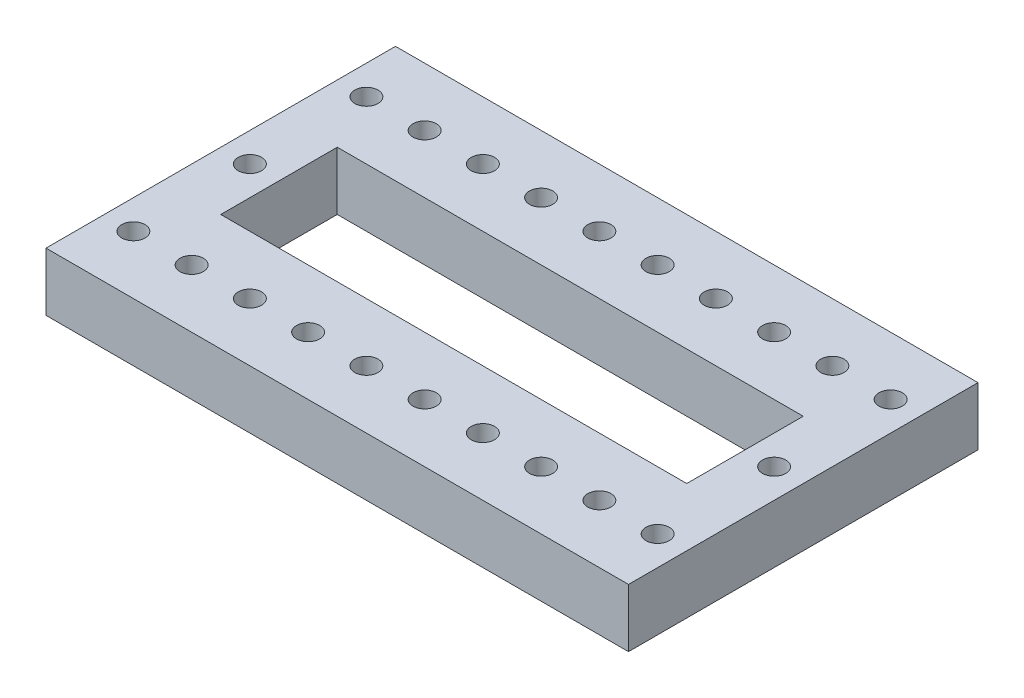
ISO-10303-21;
HEADER;
FILE_DESCRIPTION(('STEP AP214'),'2;1');
FILE_NAME('part.step','',(''),(''),'','','');
FILE_SCHEMA(('AUTOMOTIVE_DESIGN { 1 0 10303 214 1 1 1 1 }'));
ENDSEC;
DATA;
#1=APPLICATION_CONTEXT('core data for automotive mechanical design processes');
#2=APPLICATION_PROTOCOL_DEFINITION('international standard','automotive_design',2000,#1);
#3=PRODUCT_CONTEXT('',#1,'mechanical');
#4=PRODUCT('Part','Part','',(#3));
#5=PRODUCT_RELATED_PRODUCT_CATEGORY('part','',(#4));
#6=PRODUCT_DEFINITION_FORMATION('','',#4);
#7=PRODUCT_DEFINITION_CONTEXT('part definition',#1,'design');
#8=PRODUCT_DEFINITION('design','',#6,#7);
#9=PRODUCT_DEFINITION_SHAPE('','',#8);
#10=(LENGTH_UNIT() NAMED_UNIT(*) SI_UNIT(.MILLI.,.METRE.));
#11=(NAMED_UNIT(*) PLANE_ANGLE_UNIT() SI_UNIT($,.RADIAN.));
#12=(NAMED_UNIT(*) SI_UNIT($,.STERADIAN.) SOLID_ANGLE_UNIT());
#13=UNCERTAINTY_MEASURE_WITH_UNIT(LENGTH_MEASURE(1.E-05),#10,'distance_accuracy_value','');
#14=(GEOMETRIC_REPRESENTATION_CONTEXT(3) GLOBAL_UNCERTAINTY_ASSIGNED_CONTEXT((#13)) GLOBAL_UNIT_ASSIGNED_CONTEXT((#10,
#11,#12)) REPRESENTATION_CONTEXT('',''));
#15=CARTESIAN_POINT('',(0.,0.,0.));
#16=DIRECTION('',(0.,0.,1.));
#17=DIRECTION('',(1.,0.,0.));
#18=AXIS2_PLACEMENT_3D('',#15,#16,#17);
#19=CARTESIAN_POINT('',(0.,10.,0.));
#20=DIRECTION('',(0.,-1.,0.));
#21=DIRECTION('',(0.,0.,-1.));
#22=AXIS2_PLACEMENT_3D('',#19,#20,#21);
#23=PLANE('',#22);
#24=DIRECTION('',(0.,0.,1.));
#25=VECTOR('',#24,1.);
#26=CARTESIAN_POINT('',(0.,10.,0.));
#27=LINE('',#26,#25);
#28=CARTESIAN_POINT('',(0.,10.,-60.));
#29=VERTEX_POINT('',#28);
#30=CARTESIAN_POINT('',(0.,10.,0.));
#31=VERTEX_POINT('',#30);
#32=EDGE_CURVE('E137',#29,#31,#27,.T.);
#33=ORIENTED_EDGE('',*,*,#32,.T.);
#34=DIRECTION('',(1.,0.,0.));
#35=VECTOR('',#34,1.);
#36=CARTESIAN_POINT('',(0.,10.,0.));
#37=LINE('',#36,#35);
#38=CARTESIAN_POINT('',(100.,10.,0.));
#39=VERTEX_POINT('',#38);
#40=EDGE_CURVE('E140',#31,#39,#37,.T.);
#41=ORIENTED_EDGE('',*,*,#40,.T.);
#42=DIRECTION('',(0.,0.,-1.));
#43=VECTOR('',#42,1.);
#44=CARTESIAN_POINT('',(100.,10.,0.));
#45=LINE('',#44,#43);
#46=CARTESIAN_POINT('',(100.,10.,-60.));
#47=VERTEX_POINT('',#46);
#48=EDGE_CURVE('E143',#39,#47,#45,.T.);
#49=ORIENTED_EDGE('',*,*,#48,.T.);
#50=DIRECTION('',(-1.,0.,0.));
#51=VECTOR('',#50,1.);
#52=CARTESIAN_POINT('',(0.,10.,-60.));
#53=LINE('',#52,#51);
#54=EDGE_CURVE('E145',#47,#29,#53,.T.);
#55=ORIENTED_EDGE('',*,*,#54,.T.);
#56=EDGE_LOOP('',(#33,#41,#49,#55));
#57=FACE_BOUND('',#56,.T.);
#58=DIRECTION('',(-1.,0.,0.));
#59=VECTOR('',#58,1.);
#60=CARTESIAN_POINT('',(90.,10.,-40.));
#61=LINE('',#60,#59);
#62=CARTESIAN_POINT('',(90.,10.,-40.));
#63=VERTEX_POINT('',#62);
#64=CARTESIAN_POINT('',(9.99999999999999,10.,-40.));
#65=VERTEX_POINT('',#64);
#66=EDGE_CURVE('E98',#63,#65,#61,.T.);
#67=ORIENTED_EDGE('',*,*,#66,.F.);
#68=DIRECTION('',(0.,0.,-1.));
#69=VECTOR('',#68,1.);
#70=CARTESIAN_POINT('',(90.,10.,-20.));
#71=LINE('',#70,#69);
#72=CARTESIAN_POINT('',(90.,10.,-20.));
#73=VERTEX_POINT('',#72);
#74=EDGE_CURVE('E121',#73,#63,#71,.T.);
#75=ORIENTED_EDGE('',*,*,#74,.F.);
#76=DIRECTION('',(1.,0.,0.));
#77=VECTOR('',#76,1.);
#78=CARTESIAN_POINT('',(10.,10.,-20.));
#79=LINE('',#78,#77);
#80=CARTESIAN_POINT('',(10.,10.,-20.));
#81=VERTEX_POINT('',#80);
#82=EDGE_CURVE('E119',#81,#73,#79,.T.);
#83=ORIENTED_EDGE('',*,*,#82,.F.);
#84=DIRECTION('',(0.,0.,1.));
#85=VECTOR('',#84,1.);
#86=CARTESIAN_POINT('',(9.99999999999999,10.,-40.));
#87=LINE('',#86,#85);
#88=EDGE_CURVE('E106',#65,#81,#87,.T.);
#89=ORIENTED_EDGE('',*,*,#88,.F.);
#90=EDGE_LOOP('',(#67,#75,#83,#89));
#91=FACE_BOUND('',#90,.T.);
#92=CARTESIAN_POINT('',(5.,10.,-10.));
#93=DIRECTION('',(0.,1.,0.));
#94=DIRECTION('',(0.,0.,1.));
#95=AXIS2_PLACEMENT_3D('',#92,#93,#94);
#96=CIRCLE('',#95,2.);
#97=CARTESIAN_POINT('',(5.,10.,-8.));
#98=VERTEX_POINT('',#97);
#99=EDGE_CURVE('E127',#98,#98,#96,.T.);
#100=ORIENTED_EDGE('',*,*,#99,.F.);
#101=EDGE_LOOP('',(#100));
#102=FACE_BOUND('',#101,.T.);
#103=CARTESIAN_POINT('',(95.,10.,-30.));
#104=DIRECTION('',(0.,1.,0.));
#105=DIRECTION('',(0.,0.,1.));
#106=AXIS2_PLACEMENT_3D('',#103,#104,#105);
#107=CIRCLE('',#106,2.);
#108=CARTESIAN_POINT('',(95.,10.,-28.));
#109=VERTEX_POINT('',#108);
#110=EDGE_CURVE('E429',#109,#109,#107,.T.);
#111=ORIENTED_EDGE('',*,*,#110,.F.);
#112=EDGE_LOOP('',(#111));
#113=FACE_BOUND('',#112,.T.);
#114=CARTESIAN_POINT('',(5.,10.,-30.));
#115=DIRECTION('',(0.,1.,0.));
#116=DIRECTION('',(0.,0.,1.));
#117=AXIS2_PLACEMENT_3D('',#114,#115,#116);
#118=CIRCLE('',#117,2.);
#119=CARTESIAN_POINT('',(5.,10.,-28.));
#120=VERTEX_POINT('',#119);
#121=EDGE_CURVE('E423',#120,#120,#118,.T.);
#122=ORIENTED_EDGE('',*,*,#121,.F.);
#123=EDGE_LOOP('',(#122));
#124=FACE_BOUND('',#123,.T.);
#125=CARTESIAN_POINT('',(15.,10.,-10.));
#126=DIRECTION('',(0.,1.,0.));
#127=DIRECTION('',(0.,0.,1.));
#128=AXIS2_PLACEMENT_3D('',#125,#126,#127);
#129=CIRCLE('',#128,2.);
#130=CARTESIAN_POINT('',(15.,10.,-8.));
#131=VERTEX_POINT('',#130);
#132=EDGE_CURVE('E417',#131,#131,#129,.T.);
#133=ORIENTED_EDGE('',*,*,#132,.F.);
#134=EDGE_LOOP('',(#133));
#135=FACE_BOUND('',#134,.T.);
#136=CARTESIAN_POINT('',(15.,10.,-50.));
#137=DIRECTION('',(0.,1.,0.));
#138=DIRECTION('',(0.,0.,1.));
#139=AXIS2_PLACEMENT_3D('',#136,#137,#138);
#140=CIRCLE('',#139,2.);
#141=CARTESIAN_POINT('',(15.,10.,-48.));
#142=VERTEX_POINT('',#141);
#143=EDGE_CURVE('E411',#142,#142,#140,.T.);
#144=ORIENTED_EDGE('',*,*,#143,.F.);
#145=EDGE_LOOP('',(#144));
#146=FACE_BOUND('',#145,.T.);
#147=CARTESIAN_POINT('',(25.,10.,-10.));
#148=DIRECTION('',(0.,1.,0.));
#149=DIRECTION('',(0.,0.,1.));
#150=AXIS2_PLACEMENT_3D('',#147,#148,#149);
#151=CIRCLE('',#150,2.);
#152=CARTESIAN_POINT('',(25.,10.,-8.));
#153=VERTEX_POINT('',#152);
#154=EDGE_CURVE('E405',#153,#153,#151,.T.);
#155=ORIENTED_EDGE('',*,*,#154,.F.);
#156=EDGE_LOOP('',(#155));
#157=FACE_BOUND('',#156,.T.);
#158=CARTESIAN_POINT('',(25.,10.,-50.));
#159=DIRECTION('',(0.,1.,0.));
#160=DIRECTION('',(0.,0.,1.));
#161=AXIS2_PLACEMENT_3D('',#158,#159,#160);
#162=CIRCLE('',#161,2.);
#163=CARTESIAN_POINT('',(25.,10.,-48.));
#164=VERTEX_POINT('',#163);
#165=EDGE_CURVE('E399',#164,#164,#162,.T.);
#166=ORIENTED_EDGE('',*,*,#165,.F.);
#167=EDGE_LOOP('',(#166));
#168=FACE_BOUND('',#167,.T.);
#169=CARTESIAN_POINT('',(5.,10.,-50.));
#170=DIRECTION('',(0.,1.,0.));
#171=DIRECTION('',(0.,0.,1.));
#172=AXIS2_PLACEMENT_3D('',#169,#170,#171);
#173=CIRCLE('',#172,2.00000000000001);
#174=CARTESIAN_POINT('',(5.,10.,-48.));
#175=VERTEX_POINT('',#174);
#176=EDGE_CURVE('E393',#175,#175,#173,.T.);
#177=ORIENTED_EDGE('',*,*,#176,.F.);
#178=EDGE_LOOP('',(#177));
#179=FACE_BOUND('',#178,.T.);
#180=CARTESIAN_POINT('',(35.,10.,-10.));
#181=DIRECTION('',(0.,1.,0.));
#182=DIRECTION('',(0.,0.,1.));
#183=AXIS2_PLACEMENT_3D('',#180,#181,#182);
#184=CIRCLE('',#183,2.);
#185=CARTESIAN_POINT('',(35.,10.,-8.));
#186=VERTEX_POINT('',#185);
#187=EDGE_CURVE('E387',#186,#186,#184,.T.);
#188=ORIENTED_EDGE('',*,*,#187,.F.);
#189=EDGE_LOOP('',(#188));
#190=FACE_BOUND('',#189,.T.);
#191=CARTESIAN_POINT('',(35.,10.,-50.));
#192=DIRECTION('',(0.,1.,0.));
#193=DIRECTION('',(0.,0.,1.));
#194=AXIS2_PLACEMENT_3D('',#191,#192,#193);
#195=CIRCLE('',#194,2.);
#196=CARTESIAN_POINT('',(35.,10.,-48.));
#197=VERTEX_POINT('',#196);
#198=EDGE_CURVE('E381',#197,#197,#195,.T.);
#199=ORIENTED_EDGE('',*,*,#198,.F.);
#200=EDGE_LOOP('',(#199));
#201=FACE_BOUND('',#200,.T.);
#202=CARTESIAN_POINT('',(45.,10.,-10.));
#203=DIRECTION('',(0.,1.,0.));
#204=DIRECTION('',(0.,0.,1.));
#205=AXIS2_PLACEMENT_3D('',#202,#203,#204);
#206=CIRCLE('',#205,2.);
#207=CARTESIAN_POINT('',(45.,10.,-8.));
#208=VERTEX_POINT('',#207);
#209=EDGE_CURVE('E375',#208,#208,#206,.T.);
#210=ORIENTED_EDGE('',*,*,#209,.F.);
#211=EDGE_LOOP('',(#210));
#212=FACE_BOUND('',#211,.T.);
#213=CARTESIAN_POINT('',(45.,10.,-50.));
#214=DIRECTION('',(0.,1.,0.));
#215=DIRECTION('',(0.,0.,1.));
#216=AXIS2_PLACEMENT_3D('',#213,#214,#215);
#217=CIRCLE('',#216,2.00000000000001);
#218=CARTESIAN_POINT('',(45.,10.,-48.));
#219=VERTEX_POINT('',#218);
#220=EDGE_CURVE('E369',#219,#219,#217,.T.);
#221=ORIENTED_EDGE('',*,*,#220,.F.);
#222=EDGE_LOOP('',(#221));
#223=FACE_BOUND('',#222,.T.);
#224=CARTESIAN_POINT('',(55.,10.,-10.));
#225=DIRECTION('',(0.,1.,0.));
#226=DIRECTION('',(0.,0.,1.));
#227=AXIS2_PLACEMENT_3D('',#224,#225,#226);
#228=CIRCLE('',#227,2.);
#229=CARTESIAN_POINT('',(55.,10.,-8.));
#230=VERTEX_POINT('',#229);
#231=EDGE_CURVE('E363',#230,#230,#228,.T.);
#232=ORIENTED_EDGE('',*,*,#231,.F.);
#233=EDGE_LOOP('',(#232));
#234=FACE_BOUND('',#233,.T.);
#235=CARTESIAN_POINT('',(55.,10.,-50.));
#236=DIRECTION('',(0.,1.,0.));
#237=DIRECTION('',(0.,0.,1.));
#238=AXIS2_PLACEMENT_3D('',#235,#236,#237);
#239=CIRCLE('',#238,2.);
#240=CARTESIAN_POINT('',(55.,10.,-48.));
#241=VERTEX_POINT('',#240);
#242=EDGE_CURVE('E357',#241,#241,#239,.T.);
#243=ORIENTED_EDGE('',*,*,#242,.F.);
#244=EDGE_LOOP('',(#243));
#245=FACE_BOUND('',#244,.T.);
#246=CARTESIAN_POINT('',(65.,10.,-10.));
#247=DIRECTION('',(0.,1.,0.));
#248=DIRECTION('',(0.,0.,1.));
#249=AXIS2_PLACEMENT_3D('',#246,#247,#248);
#250=CIRCLE('',#249,2.);
#251=CARTESIAN_POINT('',(65.,10.,-8.));
#252=VERTEX_POINT('',#251);
#253=EDGE_CURVE('E351',#252,#252,#250,.T.);
#254=ORIENTED_EDGE('',*,*,#253,.F.);
#255=EDGE_LOOP('',(#254));
#256=FACE_BOUND('',#255,.T.);
#257=CARTESIAN_POINT('',(65.,10.,-50.));
#258=DIRECTION('',(0.,1.,0.));
#259=DIRECTION('',(0.,0.,1.));
#260=AXIS2_PLACEMENT_3D('',#257,#258,#259);
#261=CIRCLE('',#260,2.);
#262=CARTESIAN_POINT('',(65.,10.,-48.));
#263=VERTEX_POINT('',#262);
#264=EDGE_CURVE('E345',#263,#263,#261,.T.);
#265=ORIENTED_EDGE('',*,*,#264,.F.);
#266=EDGE_LOOP('',(#265));
#267=FACE_BOUND('',#266,.T.);
#268=CARTESIAN_POINT('',(75.,10.,-10.));
#269=DIRECTION('',(0.,1.,0.));
#270=DIRECTION('',(0.,0.,1.));
#271=AXIS2_PLACEMENT_3D('',#268,#269,#270);
#272=CIRCLE('',#271,2.);
#273=CARTESIAN_POINT('',(75.,10.,-8.));
#274=VERTEX_POINT('',#273);
#275=EDGE_CURVE('E339',#274,#274,#272,.T.);
#276=ORIENTED_EDGE('',*,*,#275,.F.);
#277=EDGE_LOOP('',(#276));
#278=FACE_BOUND('',#277,.T.);
#279=CARTESIAN_POINT('',(75.,10.,-50.));
#280=DIRECTION('',(0.,1.,0.));
#281=DIRECTION('',(0.,0.,1.));
#282=AXIS2_PLACEMENT_3D('',#279,#280,#281);
#283=CIRCLE('',#282,2.);
#284=CARTESIAN_POINT('',(75.,10.,-48.));
#285=VERTEX_POINT('',#284);
#286=EDGE_CURVE('E333',#285,#285,#283,.T.);
#287=ORIENTED_EDGE('',*,*,#286,.F.);
#288=EDGE_LOOP('',(#287));
#289=FACE_BOUND('',#288,.T.);
#290=CARTESIAN_POINT('',(85.,10.,-10.));
#291=DIRECTION('',(0.,1.,0.));
#292=DIRECTION('',(0.,0.,1.));
#293=AXIS2_PLACEMENT_3D('',#290,#291,#292);
#294=CIRCLE('',#293,2.);
#295=CARTESIAN_POINT('',(85.,10.,-8.));
#296=VERTEX_POINT('',#295);
#297=EDGE_CURVE('E327',#296,#296,#294,.T.);
#298=ORIENTED_EDGE('',*,*,#297,.F.);
#299=EDGE_LOOP('',(#298));
#300=FACE_BOUND('',#299,.T.);
#301=CARTESIAN_POINT('',(85.,10.,-50.));
#302=DIRECTION('',(0.,1.,0.));
#303=DIRECTION('',(0.,0.,1.));
#304=AXIS2_PLACEMENT_3D('',#301,#302,#303);
#305=CIRCLE('',#304,2.);
#306=CARTESIAN_POINT('',(85.,10.,-48.));
#307=VERTEX_POINT('',#306);
#308=EDGE_CURVE('E321',#307,#307,#305,.T.);
#309=ORIENTED_EDGE('',*,*,#308,.F.);
#310=EDGE_LOOP('',(#309));
#311=FACE_BOUND('',#310,.T.);
#312=CARTESIAN_POINT('',(95.,10.,-10.));
#313=DIRECTION('',(0.,1.,0.));
#314=DIRECTION('',(0.,0.,1.));
#315=AXIS2_PLACEMENT_3D('',#312,#313,#314);
#316=CIRCLE('',#315,2.);
#317=CARTESIAN_POINT('',(95.,10.,-8.));
#318=VERTEX_POINT('',#317);
#319=EDGE_CURVE('E315',#318,#318,#316,.T.);
#320=ORIENTED_EDGE('',*,*,#319,.F.);
#321=EDGE_LOOP('',(#320));
#322=FACE_BOUND('',#321,.T.);
#323=CARTESIAN_POINT('',(95.,10.,-50.));
#324=DIRECTION('',(0.,1.,0.));
#325=DIRECTION('',(0.,0.,1.));
#326=AXIS2_PLACEMENT_3D('',#323,#324,#325);
#327=CIRCLE('',#326,2.);
#328=CARTESIAN_POINT('',(95.,10.,-48.));
#329=VERTEX_POINT('',#328);
#330=EDGE_CURVE('E306',#329,#329,#327,.T.);
#331=ORIENTED_EDGE('',*,*,#330,.F.);
#332=EDGE_LOOP('',(#331));
#333=FACE_BOUND('',#332,.T.);
#334=ADVANCED_FACE('F33',(#57,#91,#102,#113,#124,#135,#146,#157,#168,#179,#190,#201,#212,#223,
#234,#245,#256,#267,#278,#289,#300,#311,#322,#333),#23,.F.);
#335=CARTESIAN_POINT('',(0.,0.,0.));
#336=DIRECTION('',(0.,-1.,0.));
#337=DIRECTION('',(0.,0.,-1.));
#338=AXIS2_PLACEMENT_3D('',#335,#336,#337);
#339=PLANE('',#338);
#340=CARTESIAN_POINT('',(95.,0.,-10.));
#341=DIRECTION('',(0.,1.,0.));
#342=DIRECTION('',(0.,0.,1.));
#343=AXIS2_PLACEMENT_3D('',#340,#341,#342);
#344=CIRCLE('',#343,2.);
#345=CARTESIAN_POINT('',(95.,0.,-8.));
#346=VERTEX_POINT('',#345);
#347=EDGE_CURVE('E312',#346,#346,#344,.T.);
#348=ORIENTED_EDGE('',*,*,#347,.T.);
#349=EDGE_LOOP('',(#348));
#350=FACE_BOUND('',#349,.T.);
#351=CARTESIAN_POINT('',(85.,0.,-10.));
#352=DIRECTION('',(0.,1.,0.));
#353=DIRECTION('',(0.,0.,1.));
#354=AXIS2_PLACEMENT_3D('',#351,#352,#353);
#355=CIRCLE('',#354,2.);
#356=CARTESIAN_POINT('',(85.,0.,-8.));
#357=VERTEX_POINT('',#356);
#358=EDGE_CURVE('E324',#357,#357,#355,.T.);
#359=ORIENTED_EDGE('',*,*,#358,.T.);
#360=EDGE_LOOP('',(#359));
#361=FACE_BOUND('',#360,.T.);
#362=CARTESIAN_POINT('',(75.,0.,-10.));
#363=DIRECTION('',(0.,1.,0.));
#364=DIRECTION('',(0.,0.,1.));
#365=AXIS2_PLACEMENT_3D('',#362,#363,#364);
#366=CIRCLE('',#365,2.);
#367=CARTESIAN_POINT('',(75.,0.,-8.));
#368=VERTEX_POINT('',#367);
#369=EDGE_CURVE('E336',#368,#368,#366,.T.);
#370=ORIENTED_EDGE('',*,*,#369,.T.);
#371=EDGE_LOOP('',(#370));
#372=FACE_BOUND('',#371,.T.);
#373=CARTESIAN_POINT('',(65.,0.,-10.));
#374=DIRECTION('',(0.,1.,0.));
#375=DIRECTION('',(0.,0.,1.));
#376=AXIS2_PLACEMENT_3D('',#373,#374,#375);
#377=CIRCLE('',#376,2.);
#378=CARTESIAN_POINT('',(65.,0.,-8.));
#379=VERTEX_POINT('',#378);
#380=EDGE_CURVE('E348',#379,#379,#377,.T.);
#381=ORIENTED_EDGE('',*,*,#380,.T.);
#382=EDGE_LOOP('',(#381));
#383=FACE_BOUND('',#382,.T.);
#384=CARTESIAN_POINT('',(55.,0.,-10.));
#385=DIRECTION('',(0.,1.,0.));
#386=DIRECTION('',(0.,0.,1.));
#387=AXIS2_PLACEMENT_3D('',#384,#385,#386);
#388=CIRCLE('',#387,2.);
#389=CARTESIAN_POINT('',(55.,0.,-8.));
#390=VERTEX_POINT('',#389);
#391=EDGE_CURVE('E360',#390,#390,#388,.T.);
#392=ORIENTED_EDGE('',*,*,#391,.T.);
#393=EDGE_LOOP('',(#392));
#394=FACE_BOUND('',#393,.T.);
#395=CARTESIAN_POINT('',(45.,0.,-10.));
#396=DIRECTION('',(0.,1.,0.));
#397=DIRECTION('',(0.,0.,1.));
#398=AXIS2_PLACEMENT_3D('',#395,#396,#397);
#399=CIRCLE('',#398,2.);
#400=CARTESIAN_POINT('',(45.,0.,-8.));
#401=VERTEX_POINT('',#400);
#402=EDGE_CURVE('E372',#401,#401,#399,.T.);
#403=ORIENTED_EDGE('',*,*,#402,.T.);
#404=EDGE_LOOP('',(#403));
#405=FACE_BOUND('',#404,.T.);
#406=CARTESIAN_POINT('',(35.,0.,-10.));
#407=DIRECTION('',(0.,1.,0.));
#408=DIRECTION('',(0.,0.,1.));
#409=AXIS2_PLACEMENT_3D('',#406,#407,#408);
#410=CIRCLE('',#409,2.);
#411=CARTESIAN_POINT('',(35.,0.,-8.));
#412=VERTEX_POINT('',#411);
#413=EDGE_CURVE('E384',#412,#412,#410,.T.);
#414=ORIENTED_EDGE('',*,*,#413,.T.);
#415=EDGE_LOOP('',(#414));
#416=FACE_BOUND('',#415,.T.);
#417=CARTESIAN_POINT('',(25.,0.,-50.));
#418=DIRECTION('',(0.,1.,0.));
#419=DIRECTION('',(0.,0.,1.));
#420=AXIS2_PLACEMENT_3D('',#417,#418,#419);
#421=CIRCLE('',#420,2.);
#422=CARTESIAN_POINT('',(25.,0.,-48.));
#423=VERTEX_POINT('',#422);
#424=EDGE_CURVE('E396',#423,#423,#421,.T.);
#425=ORIENTED_EDGE('',*,*,#424,.T.);
#426=EDGE_LOOP('',(#425));
#427=FACE_BOUND('',#426,.T.);
#428=CARTESIAN_POINT('',(15.,0.,-50.));
#429=DIRECTION('',(0.,1.,0.));
#430=DIRECTION('',(0.,0.,1.));
#431=AXIS2_PLACEMENT_3D('',#428,#429,#430);
#432=CIRCLE('',#431,2.);
#433=CARTESIAN_POINT('',(15.,0.,-48.));
#434=VERTEX_POINT('',#433);
#435=EDGE_CURVE('E408',#434,#434,#432,.T.);
#436=ORIENTED_EDGE('',*,*,#435,.T.);
#437=EDGE_LOOP('',(#436));
#438=FACE_BOUND('',#437,.T.);
#439=CARTESIAN_POINT('',(5.,0.,-30.));
#440=DIRECTION('',(0.,1.,0.));
#441=DIRECTION('',(0.,0.,1.));
#442=AXIS2_PLACEMENT_3D('',#439,#440,#441);
#443=CIRCLE('',#442,2.);
#444=CARTESIAN_POINT('',(5.,0.,-28.));
#445=VERTEX_POINT('',#444);
#446=EDGE_CURVE('E420',#445,#445,#443,.T.);
#447=ORIENTED_EDGE('',*,*,#446,.T.);
#448=EDGE_LOOP('',(#447));
#449=FACE_BOUND('',#448,.T.);
#450=CARTESIAN_POINT('',(5.,0.,-10.));
#451=DIRECTION('',(0.,1.,0.));
#452=DIRECTION('',(0.,0.,1.));
#453=AXIS2_PLACEMENT_3D('',#450,#451,#452);
#454=CIRCLE('',#453,2.);
#455=CARTESIAN_POINT('',(5.,0.,-8.));
#456=VERTEX_POINT('',#455);
#457=EDGE_CURVE('E432',#456,#456,#454,.T.);
#458=ORIENTED_EDGE('',*,*,#457,.T.);
#459=EDGE_LOOP('',(#458));
#460=FACE_BOUND('',#459,.T.);
#461=DIRECTION('',(0.,0.,1.));
#462=VECTOR('',#461,1.);
#463=CARTESIAN_POINT('',(0.,0.,0.));
#464=LINE('',#463,#462);
#465=CARTESIAN_POINT('',(0.,0.,-60.));
#466=VERTEX_POINT('',#465);
#467=CARTESIAN_POINT('',(0.,0.,0.));
#468=VERTEX_POINT('',#467);
#469=EDGE_CURVE('E114',#466,#468,#464,.T.);
#470=ORIENTED_EDGE('',*,*,#469,.F.);
#471=DIRECTION('',(-1.,0.,0.));
#472=VECTOR('',#471,1.);
#473=CARTESIAN_POINT('',(0.,0.,-60.));
#474=LINE('',#473,#472);
#475=CARTESIAN_POINT('',(100.,0.,-60.));
#476=VERTEX_POINT('',#475);
#477=EDGE_CURVE('E141',#476,#466,#474,.T.);
#478=ORIENTED_EDGE('',*,*,#477,.F.);
#479=DIRECTION('',(0.,0.,-1.));
#480=VECTOR('',#479,1.);
#481=CARTESIAN_POINT('',(100.,0.,0.));
#482=LINE('',#481,#480);
#483=CARTESIAN_POINT('',(100.,0.,0.));
#484=VERTEX_POINT('',#483);
#485=EDGE_CURVE('E152',#484,#476,#482,.T.);
#486=ORIENTED_EDGE('',*,*,#485,.F.);
#487=DIRECTION('',(1.,0.,0.));
#488=VECTOR('',#487,1.);
#489=CARTESIAN_POINT('',(0.,0.,0.));
#490=LINE('',#489,#488);
#491=EDGE_CURVE('E150',#468,#484,#490,.T.);
#492=ORIENTED_EDGE('',*,*,#491,.F.);
#493=EDGE_LOOP('',(#470,#478,#486,#492));
#494=FACE_BOUND('',#493,.T.);
#495=DIRECTION('',(0.,0.,-1.));
#496=VECTOR('',#495,1.);
#497=CARTESIAN_POINT('',(90.,0.,-20.));
#498=LINE('',#497,#496);
#499=CARTESIAN_POINT('',(90.,0.,-20.));
#500=VERTEX_POINT('',#499);
#501=CARTESIAN_POINT('',(90.,0.,-40.));
#502=VERTEX_POINT('',#501);
#503=EDGE_CURVE('E107',#500,#502,#498,.T.);
#504=ORIENTED_EDGE('',*,*,#503,.T.);
#505=DIRECTION('',(-1.,0.,0.));
#506=VECTOR('',#505,1.);
#507=CARTESIAN_POINT('',(90.,0.,-40.));
#508=LINE('',#507,#506);
#509=CARTESIAN_POINT('',(9.99999999999999,0.,-40.));
#510=VERTEX_POINT('',#509);
#511=EDGE_CURVE('E56',#502,#510,#508,.T.);
#512=ORIENTED_EDGE('',*,*,#511,.T.);
#513=DIRECTION('',(0.,0.,1.));
#514=VECTOR('',#513,1.);
#515=CARTESIAN_POINT('',(9.99999999999999,0.,-40.));
#516=LINE('',#515,#514);
#517=CARTESIAN_POINT('',(10.,0.,-20.));
#518=VERTEX_POINT('',#517);
#519=EDGE_CURVE('E113',#510,#518,#516,.T.);
#520=ORIENTED_EDGE('',*,*,#519,.T.);
#521=DIRECTION('',(1.,0.,0.));
#522=VECTOR('',#521,1.);
#523=CARTESIAN_POINT('',(10.,0.,-20.));
#524=LINE('',#523,#522);
#525=EDGE_CURVE('E129',#518,#500,#524,.T.);
#526=ORIENTED_EDGE('',*,*,#525,.T.);
#527=EDGE_LOOP('',(#504,#512,#520,#526));
#528=FACE_BOUND('',#527,.T.);
#529=CARTESIAN_POINT('',(95.,0.,-30.));
#530=DIRECTION('',(0.,1.,0.));
#531=DIRECTION('',(0.,0.,1.));
#532=AXIS2_PLACEMENT_3D('',#529,#530,#531);
#533=CIRCLE('',#532,2.);
#534=CARTESIAN_POINT('',(95.,0.,-28.));
#535=VERTEX_POINT('',#534);
#536=EDGE_CURVE('E426',#535,#535,#533,.T.);
#537=ORIENTED_EDGE('',*,*,#536,.T.);
#538=EDGE_LOOP('',(#537));
#539=FACE_BOUND('',#538,.T.);
#540=CARTESIAN_POINT('',(15.,0.,-10.));
#541=DIRECTION('',(0.,1.,0.));
#542=DIRECTION('',(0.,0.,1.));
#543=AXIS2_PLACEMENT_3D('',#540,#541,#542);
#544=CIRCLE('',#543,2.);
#545=CARTESIAN_POINT('',(15.,0.,-8.));
#546=VERTEX_POINT('',#545);
#547=EDGE_CURVE('E414',#546,#546,#544,.T.);
#548=ORIENTED_EDGE('',*,*,#547,.T.);
#549=EDGE_LOOP('',(#548));
#550=FACE_BOUND('',#549,.T.);
#551=CARTESIAN_POINT('',(25.,0.,-10.));
#552=DIRECTION('',(0.,1.,0.));
#553=DIRECTION('',(0.,0.,1.));
#554=AXIS2_PLACEMENT_3D('',#551,#552,#553);
#555=CIRCLE('',#554,2.);
#556=CARTESIAN_POINT('',(25.,0.,-8.));
#557=VERTEX_POINT('',#556);
#558=EDGE_CURVE('E402',#557,#557,#555,.T.);
#559=ORIENTED_EDGE('',*,*,#558,.T.);
#560=EDGE_LOOP('',(#559));
#561=FACE_BOUND('',#560,.T.);
#562=CARTESIAN_POINT('',(5.,0.,-50.));
#563=DIRECTION('',(0.,1.,0.));
#564=DIRECTION('',(0.,0.,1.));
#565=AXIS2_PLACEMENT_3D('',#562,#563,#564);
#566=CIRCLE('',#565,2.00000000000001);
#567=CARTESIAN_POINT('',(5.,0.,-48.));
#568=VERTEX_POINT('',#567);
#569=EDGE_CURVE('E390',#568,#568,#566,.T.);
#570=ORIENTED_EDGE('',*,*,#569,.T.);
#571=EDGE_LOOP('',(#570));
#572=FACE_BOUND('',#571,.T.);
#573=CARTESIAN_POINT('',(35.,0.,-50.));
#574=DIRECTION('',(0.,1.,0.));
#575=DIRECTION('',(0.,0.,1.));
#576=AXIS2_PLACEMENT_3D('',#573,#574,#575);
#577=CIRCLE('',#576,2.);
#578=CARTESIAN_POINT('',(35.,0.,-48.));
#579=VERTEX_POINT('',#578);
#580=EDGE_CURVE('E378',#579,#579,#577,.T.);
#581=ORIENTED_EDGE('',*,*,#580,.T.);
#582=EDGE_LOOP('',(#581));
#583=FACE_BOUND('',#582,.T.);
#584=CARTESIAN_POINT('',(45.,0.,-50.));
#585=DIRECTION('',(0.,1.,0.));
#586=DIRECTION('',(0.,0.,1.));
#587=AXIS2_PLACEMENT_3D('',#584,#585,#586);
#588=CIRCLE('',#587,2.00000000000001);
#589=CARTESIAN_POINT('',(45.,0.,-48.));
#590=VERTEX_POINT('',#589);
#591=EDGE_CURVE('E366',#590,#590,#588,.T.);
#592=ORIENTED_EDGE('',*,*,#591,.T.);
#593=EDGE_LOOP('',(#592));
#594=FACE_BOUND('',#593,.T.);
#595=CARTESIAN_POINT('',(55.,0.,-50.));
#596=DIRECTION('',(0.,1.,0.));
#597=DIRECTION('',(0.,0.,1.));
#598=AXIS2_PLACEMENT_3D('',#595,#596,#597);
#599=CIRCLE('',#598,2.);
#600=CARTESIAN_POINT('',(55.,0.,-48.));
#601=VERTEX_POINT('',#600);
#602=EDGE_CURVE('E354',#601,#601,#599,.T.);
#603=ORIENTED_EDGE('',*,*,#602,.T.);
#604=EDGE_LOOP('',(#603));
#605=FACE_BOUND('',#604,.T.);
#606=CARTESIAN_POINT('',(65.,0.,-50.));
#607=DIRECTION('',(0.,1.,0.));
#608=DIRECTION('',(0.,0.,1.));
#609=AXIS2_PLACEMENT_3D('',#606,#607,#608);
#610=CIRCLE('',#609,2.);
#611=CARTESIAN_POINT('',(65.,0.,-48.));
#612=VERTEX_POINT('',#611);
#613=EDGE_CURVE('E342',#612,#612,#610,.T.);
#614=ORIENTED_EDGE('',*,*,#613,.T.);
#615=EDGE_LOOP('',(#614));
#616=FACE_BOUND('',#615,.T.);
#617=CARTESIAN_POINT('',(75.,0.,-50.));
#618=DIRECTION('',(0.,1.,0.));
#619=DIRECTION('',(0.,0.,1.));
#620=AXIS2_PLACEMENT_3D('',#617,#618,#619);
#621=CIRCLE('',#620,2.);
#622=CARTESIAN_POINT('',(75.,0.,-48.));
#623=VERTEX_POINT('',#622);
#624=EDGE_CURVE('E330',#623,#623,#621,.T.);
#625=ORIENTED_EDGE('',*,*,#624,.T.);
#626=EDGE_LOOP('',(#625));
#627=FACE_BOUND('',#626,.T.);
#628=CARTESIAN_POINT('',(85.,0.,-50.));
#629=DIRECTION('',(0.,1.,0.));
#630=DIRECTION('',(0.,0.,1.));
#631=AXIS2_PLACEMENT_3D('',#628,#629,#630);
#632=CIRCLE('',#631,2.);
#633=CARTESIAN_POINT('',(85.,0.,-48.));
#634=VERTEX_POINT('',#633);
#635=EDGE_CURVE('E318',#634,#634,#632,.T.);
#636=ORIENTED_EDGE('',*,*,#635,.T.);
#637=EDGE_LOOP('',(#636));
#638=FACE_BOUND('',#637,.T.);
#639=CARTESIAN_POINT('',(95.,0.,-50.));
#640=DIRECTION('',(0.,1.,0.));
#641=DIRECTION('',(0.,0.,1.));
#642=AXIS2_PLACEMENT_3D('',#639,#640,#641);
#643=CIRCLE('',#642,2.);
#644=CARTESIAN_POINT('',(95.,0.,-48.));
#645=VERTEX_POINT('',#644);
#646=EDGE_CURVE('E309',#645,#645,#643,.T.);
#647=ORIENTED_EDGE('',*,*,#646,.T.);
#648=EDGE_LOOP('',(#647));
#649=FACE_BOUND('',#648,.T.);
#650=ADVANCED_FACE('F170',(#350,#361,#372,#383,#394,#405,#416,#427,#438,#449,#460,#494,#528,
#539,#550,#561,#572,#583,#594,#605,#616,#627,#638,#649),#339,.T.);
#651=CARTESIAN_POINT('',(0.,10.,0.));
#652=DIRECTION('',(1.,0.,0.));
#653=DIRECTION('',(0.,0.,-1.));
#654=AXIS2_PLACEMENT_3D('',#651,#652,#653);
#655=PLANE('',#654);
#656=ORIENTED_EDGE('',*,*,#469,.T.);
#657=DIRECTION('',(0.,-1.,0.));
#658=VECTOR('',#657,1.);
#659=CARTESIAN_POINT('',(0.,10.,0.));
#660=LINE('',#659,#658);
#661=EDGE_CURVE('E11',#31,#468,#660,.T.);
#662=ORIENTED_EDGE('',*,*,#661,.F.);
#663=ORIENTED_EDGE('',*,*,#32,.F.);
#664=DIRECTION('',(0.,-1.,0.));
#665=VECTOR('',#664,1.);
#666=CARTESIAN_POINT('',(0.,10.,-60.));
#667=LINE('',#666,#665);
#668=EDGE_CURVE('E147',#29,#466,#667,.T.);
#669=ORIENTED_EDGE('',*,*,#668,.T.);
#670=EDGE_LOOP('',(#656,#662,#663,#669));
#671=FACE_BOUND('',#670,.T.);
#672=ADVANCED_FACE('F35',(#671),#655,.F.);
#673=CARTESIAN_POINT('',(0.,10.,0.));
#674=DIRECTION('',(0.,0.,-1.));
#675=DIRECTION('',(-1.,0.,0.));
#676=AXIS2_PLACEMENT_3D('',#673,#674,#675);
#677=PLANE('',#676);
#678=ORIENTED_EDGE('',*,*,#491,.T.);
#679=DIRECTION('',(0.,-1.,0.));
#680=VECTOR('',#679,1.);
#681=CARTESIAN_POINT('',(100.,10.,0.));
#682=LINE('',#681,#680);
#683=EDGE_CURVE('E41',#39,#484,#682,.T.);
#684=ORIENTED_EDGE('',*,*,#683,.F.);
#685=ORIENTED_EDGE('',*,*,#40,.F.);
#686=ORIENTED_EDGE('',*,*,#661,.T.);
#687=EDGE_LOOP('',(#678,#684,#685,#686));
#688=FACE_BOUND('',#687,.T.);
#689=ADVANCED_FACE('F180',(#688),#677,.F.);
#690=CARTESIAN_POINT('',(100.,10.,0.));
#691=DIRECTION('',(-1.,0.,0.));
#692=DIRECTION('',(0.,0.,1.));
#693=AXIS2_PLACEMENT_3D('',#690,#691,#692);
#694=PLANE('',#693);
#695=ORIENTED_EDGE('',*,*,#485,.T.);
#696=DIRECTION('',(0.,-1.,0.));
#697=VECTOR('',#696,1.);
#698=CARTESIAN_POINT('',(100.,10.,-60.));
#699=LINE('',#698,#697);
#700=EDGE_CURVE('E157',#47,#476,#699,.T.);
#701=ORIENTED_EDGE('',*,*,#700,.F.);
#702=ORIENTED_EDGE('',*,*,#48,.F.);
#703=ORIENTED_EDGE('',*,*,#683,.T.);
#704=EDGE_LOOP('',(#695,#701,#702,#703));
#705=FACE_BOUND('',#704,.T.);
#706=ADVANCED_FACE('F164',(#705),#694,.F.);
#707=CARTESIAN_POINT('',(0.,10.,-60.));
#708=DIRECTION('',(0.,0.,1.));
#709=DIRECTION('',(1.,0.,0.));
#710=AXIS2_PLACEMENT_3D('',#707,#708,#709);
#711=PLANE('',#710);
#712=ORIENTED_EDGE('',*,*,#477,.T.);
#713=ORIENTED_EDGE('',*,*,#668,.F.);
#714=ORIENTED_EDGE('',*,*,#54,.F.);
#715=ORIENTED_EDGE('',*,*,#700,.T.);
#716=EDGE_LOOP('',(#712,#713,#714,#715));
#717=FACE_BOUND('',#716,.T.);
#718=ADVANCED_FACE('F174',(#717),#711,.F.);
#719=CARTESIAN_POINT('',(90.,10.,-40.));
#720=DIRECTION('',(0.,0.,1.));
#721=DIRECTION('',(1.,0.,0.));
#722=AXIS2_PLACEMENT_3D('',#719,#720,#721);
#723=PLANE('',#722);
#724=ORIENTED_EDGE('',*,*,#511,.F.);
#725=DIRECTION('',(0.,-1.,0.));
#726=VECTOR('',#725,1.);
#727=CARTESIAN_POINT('',(90.,10.,-40.));
#728=LINE('',#727,#726);
#729=EDGE_CURVE('E102',#63,#502,#728,.T.);
#730=ORIENTED_EDGE('',*,*,#729,.F.);
#731=ORIENTED_EDGE('',*,*,#66,.T.);
#732=DIRECTION('',(0.,-1.,0.));
#733=VECTOR('',#732,1.);
#734=CARTESIAN_POINT('',(9.99999999999999,10.,-40.));
#735=LINE('',#734,#733);
#736=EDGE_CURVE('E101',#65,#510,#735,.T.);
#737=ORIENTED_EDGE('',*,*,#736,.T.);
#738=EDGE_LOOP('',(#724,#730,#731,#737));
#739=FACE_BOUND('',#738,.T.);
#740=ADVANCED_FACE('F100',(#739),#723,.T.);
#741=CARTESIAN_POINT('',(9.99999999999999,10.,-40.));
#742=DIRECTION('',(1.,0.,0.));
#743=DIRECTION('',(0.,0.,-1.));
#744=AXIS2_PLACEMENT_3D('',#741,#742,#743);
#745=PLANE('',#744);
#746=ORIENTED_EDGE('',*,*,#519,.F.);
#747=ORIENTED_EDGE('',*,*,#736,.F.);
#748=ORIENTED_EDGE('',*,*,#88,.T.);
#749=DIRECTION('',(0.,-1.,0.));
#750=VECTOR('',#749,1.);
#751=CARTESIAN_POINT('',(10.,10.,-20.));
#752=LINE('',#751,#750);
#753=EDGE_CURVE('E115',#81,#518,#752,.T.);
#754=ORIENTED_EDGE('',*,*,#753,.T.);
#755=EDGE_LOOP('',(#746,#747,#748,#754));
#756=FACE_BOUND('',#755,.T.);
#757=ADVANCED_FACE('F110',(#756),#745,.T.);
#758=CARTESIAN_POINT('',(10.,10.,-20.));
#759=DIRECTION('',(0.,0.,-1.));
#760=DIRECTION('',(-1.,0.,0.));
#761=AXIS2_PLACEMENT_3D('',#758,#759,#760);
#762=PLANE('',#761);
#763=ORIENTED_EDGE('',*,*,#525,.F.);
#764=ORIENTED_EDGE('',*,*,#753,.F.);
#765=ORIENTED_EDGE('',*,*,#82,.T.);
#766=DIRECTION('',(0.,-1.,0.));
#767=VECTOR('',#766,1.);
#768=CARTESIAN_POINT('',(90.,10.,-20.));
#769=LINE('',#768,#767);
#770=EDGE_CURVE('E48',#73,#500,#769,.T.);
#771=ORIENTED_EDGE('',*,*,#770,.T.);
#772=EDGE_LOOP('',(#763,#764,#765,#771));
#773=FACE_BOUND('',#772,.T.);
#774=ADVANCED_FACE('F204',(#773),#762,.T.);
#775=CARTESIAN_POINT('',(90.,10.,-20.));
#776=DIRECTION('',(-1.,0.,0.));
#777=DIRECTION('',(0.,0.,1.));
#778=AXIS2_PLACEMENT_3D('',#775,#776,#777);
#779=PLANE('',#778);
#780=ORIENTED_EDGE('',*,*,#503,.F.);
#781=ORIENTED_EDGE('',*,*,#770,.F.);
#782=ORIENTED_EDGE('',*,*,#74,.T.);
#783=ORIENTED_EDGE('',*,*,#729,.T.);
#784=EDGE_LOOP('',(#780,#781,#782,#783));
#785=FACE_BOUND('',#784,.T.);
#786=ADVANCED_FACE('F208',(#785),#779,.T.);
#787=CARTESIAN_POINT('',(5.,10.,-10.));
#788=DIRECTION('',(0.,-1.,0.));
#789=DIRECTION('',(0.,0.,-1.));
#790=AXIS2_PLACEMENT_3D('',#787,#788,#789);
#791=CYLINDRICAL_SURFACE('',#790,2.);
#792=ORIENTED_EDGE('',*,*,#99,.T.);
#793=EDGE_LOOP('',(#792));
#794=FACE_BOUND('',#793,.T.);
#795=ORIENTED_EDGE('',*,*,#457,.F.);
#796=EDGE_LOOP('',(#795));
#797=FACE_BOUND('',#796,.T.);
#798=ADVANCED_FACE('F214',(#794,#797),#791,.F.);
#799=CARTESIAN_POINT('',(95.,10.,-30.));
#800=DIRECTION('',(0.,-1.,0.));
#801=DIRECTION('',(0.,0.,-1.));
#802=AXIS2_PLACEMENT_3D('',#799,#800,#801);
#803=CYLINDRICAL_SURFACE('',#802,2.);
#804=ORIENTED_EDGE('',*,*,#110,.T.);
#805=EDGE_LOOP('',(#804));
#806=FACE_BOUND('',#805,.T.);
#807=ORIENTED_EDGE('',*,*,#536,.F.);
#808=EDGE_LOOP('',(#807));
#809=FACE_BOUND('',#808,.T.);
#810=ADVANCED_FACE('F217',(#806,#809),#803,.F.);
#811=CARTESIAN_POINT('',(5.,10.,-30.));
#812=DIRECTION('',(0.,-1.,0.));
#813=DIRECTION('',(0.,0.,-1.));
#814=AXIS2_PLACEMENT_3D('',#811,#812,#813);
#815=CYLINDRICAL_SURFACE('',#814,2.);
#816=ORIENTED_EDGE('',*,*,#121,.T.);
#817=EDGE_LOOP('',(#816));
#818=FACE_BOUND('',#817,.T.);
#819=ORIENTED_EDGE('',*,*,#446,.F.);
#820=EDGE_LOOP('',(#819));
#821=FACE_BOUND('',#820,.T.);
#822=ADVANCED_FACE('F221',(#818,#821),#815,.F.);
#823=CARTESIAN_POINT('',(15.,10.,-10.));
#824=DIRECTION('',(0.,-1.,0.));
#825=DIRECTION('',(0.,0.,-1.));
#826=AXIS2_PLACEMENT_3D('',#823,#824,#825);
#827=CYLINDRICAL_SURFACE('',#826,2.);
#828=ORIENTED_EDGE('',*,*,#132,.T.);
#829=EDGE_LOOP('',(#828));
#830=FACE_BOUND('',#829,.T.);
#831=ORIENTED_EDGE('',*,*,#547,.F.);
#832=EDGE_LOOP('',(#831));
#833=FACE_BOUND('',#832,.T.);
#834=ADVANCED_FACE('F225',(#830,#833),#827,.F.);
#835=CARTESIAN_POINT('',(15.,10.,-50.));
#836=DIRECTION('',(0.,-1.,0.));
#837=DIRECTION('',(0.,0.,-1.));
#838=AXIS2_PLACEMENT_3D('',#835,#836,#837);
#839=CYLINDRICAL_SURFACE('',#838,2.);
#840=ORIENTED_EDGE('',*,*,#143,.T.);
#841=EDGE_LOOP('',(#840));
#842=FACE_BOUND('',#841,.T.);
#843=ORIENTED_EDGE('',*,*,#435,.F.);
#844=EDGE_LOOP('',(#843));
#845=FACE_BOUND('',#844,.T.);
#846=ADVANCED_FACE('F229',(#842,#845),#839,.F.);
#847=CARTESIAN_POINT('',(25.,10.,-10.));
#848=DIRECTION('',(0.,-1.,0.));
#849=DIRECTION('',(0.,0.,-1.));
#850=AXIS2_PLACEMENT_3D('',#847,#848,#849);
#851=CYLINDRICAL_SURFACE('',#850,2.);
#852=ORIENTED_EDGE('',*,*,#154,.T.);
#853=EDGE_LOOP('',(#852));
#854=FACE_BOUND('',#853,.T.);
#855=ORIENTED_EDGE('',*,*,#558,.F.);
#856=EDGE_LOOP('',(#855));
#857=FACE_BOUND('',#856,.T.);
#858=ADVANCED_FACE('F233',(#854,#857),#851,.F.);
#859=CARTESIAN_POINT('',(25.,10.,-50.));
#860=DIRECTION('',(0.,-1.,0.));
#861=DIRECTION('',(0.,0.,-1.));
#862=AXIS2_PLACEMENT_3D('',#859,#860,#861);
#863=CYLINDRICAL_SURFACE('',#862,2.);
#864=ORIENTED_EDGE('',*,*,#165,.T.);
#865=EDGE_LOOP('',(#864));
#866=FACE_BOUND('',#865,.T.);
#867=ORIENTED_EDGE('',*,*,#424,.F.);
#868=EDGE_LOOP('',(#867));
#869=FACE_BOUND('',#868,.T.);
#870=ADVANCED_FACE('F237',(#866,#869),#863,.F.);
#871=CARTESIAN_POINT('',(5.,10.,-50.));
#872=DIRECTION('',(0.,-1.,0.));
#873=DIRECTION('',(0.,0.,-1.));
#874=AXIS2_PLACEMENT_3D('',#871,#872,#873);
#875=CYLINDRICAL_SURFACE('',#874,2.00000000000001);
#876=ORIENTED_EDGE('',*,*,#176,.T.);
#877=EDGE_LOOP('',(#876));
#878=FACE_BOUND('',#877,.T.);
#879=ORIENTED_EDGE('',*,*,#569,.F.);
#880=EDGE_LOOP('',(#879));
#881=FACE_BOUND('',#880,.T.);
#882=ADVANCED_FACE('F241',(#878,#881),#875,.F.);
#883=CARTESIAN_POINT('',(35.,10.,-10.));
#884=DIRECTION('',(0.,-1.,0.));
#885=DIRECTION('',(0.,0.,-1.));
#886=AXIS2_PLACEMENT_3D('',#883,#884,#885);
#887=CYLINDRICAL_SURFACE('',#886,2.);
#888=ORIENTED_EDGE('',*,*,#187,.T.);
#889=EDGE_LOOP('',(#888));
#890=FACE_BOUND('',#889,.T.);
#891=ORIENTED_EDGE('',*,*,#413,.F.);
#892=EDGE_LOOP('',(#891));
#893=FACE_BOUND('',#892,.T.);
#894=ADVANCED_FACE('F245',(#890,#893),#887,.F.);
#895=CARTESIAN_POINT('',(35.,10.,-50.));
#896=DIRECTION('',(0.,-1.,0.));
#897=DIRECTION('',(0.,0.,-1.));
#898=AXIS2_PLACEMENT_3D('',#895,#896,#897);
#899=CYLINDRICAL_SURFACE('',#898,2.);
#900=ORIENTED_EDGE('',*,*,#198,.T.);
#901=EDGE_LOOP('',(#900));
#902=FACE_BOUND('',#901,.T.);
#903=ORIENTED_EDGE('',*,*,#580,.F.);
#904=EDGE_LOOP('',(#903));
#905=FACE_BOUND('',#904,.T.);
#906=ADVANCED_FACE('F249',(#902,#905),#899,.F.);
#907=CARTESIAN_POINT('',(45.,10.,-10.));
#908=DIRECTION('',(0.,-1.,0.));
#909=DIRECTION('',(0.,0.,-1.));
#910=AXIS2_PLACEMENT_3D('',#907,#908,#909);
#911=CYLINDRICAL_SURFACE('',#910,2.);
#912=ORIENTED_EDGE('',*,*,#209,.T.);
#913=EDGE_LOOP('',(#912));
#914=FACE_BOUND('',#913,.T.);
#915=ORIENTED_EDGE('',*,*,#402,.F.);
#916=EDGE_LOOP('',(#915));
#917=FACE_BOUND('',#916,.T.);
#918=ADVANCED_FACE('F253',(#914,#917),#911,.F.);
#919=CARTESIAN_POINT('',(45.,10.,-50.));
#920=DIRECTION('',(0.,-1.,0.));
#921=DIRECTION('',(0.,0.,-1.));
#922=AXIS2_PLACEMENT_3D('',#919,#920,#921);
#923=CYLINDRICAL_SURFACE('',#922,2.00000000000001);
#924=ORIENTED_EDGE('',*,*,#220,.T.);
#925=EDGE_LOOP('',(#924));
#926=FACE_BOUND('',#925,.T.);
#927=ORIENTED_EDGE('',*,*,#591,.F.);
#928=EDGE_LOOP('',(#927));
#929=FACE_BOUND('',#928,.T.);
#930=ADVANCED_FACE('F257',(#926,#929),#923,.F.);
#931=CARTESIAN_POINT('',(55.,10.,-10.));
#932=DIRECTION('',(0.,-1.,0.));
#933=DIRECTION('',(0.,0.,-1.));
#934=AXIS2_PLACEMENT_3D('',#931,#932,#933);
#935=CYLINDRICAL_SURFACE('',#934,2.);
#936=ORIENTED_EDGE('',*,*,#231,.T.);
#937=EDGE_LOOP('',(#936));
#938=FACE_BOUND('',#937,.T.);
#939=ORIENTED_EDGE('',*,*,#391,.F.);
#940=EDGE_LOOP('',(#939));
#941=FACE_BOUND('',#940,.T.);
#942=ADVANCED_FACE('F261',(#938,#941),#935,.F.);
#943=CARTESIAN_POINT('',(55.,10.,-50.));
#944=DIRECTION('',(0.,-1.,0.));
#945=DIRECTION('',(0.,0.,-1.));
#946=AXIS2_PLACEMENT_3D('',#943,#944,#945);
#947=CYLINDRICAL_SURFACE('',#946,2.);
#948=ORIENTED_EDGE('',*,*,#242,.T.);
#949=EDGE_LOOP('',(#948));
#950=FACE_BOUND('',#949,.T.);
#951=ORIENTED_EDGE('',*,*,#602,.F.);
#952=EDGE_LOOP('',(#951));
#953=FACE_BOUND('',#952,.T.);
#954=ADVANCED_FACE('F265',(#950,#953),#947,.F.);
#955=CARTESIAN_POINT('',(65.,10.,-10.));
#956=DIRECTION('',(0.,-1.,0.));
#957=DIRECTION('',(0.,0.,-1.));
#958=AXIS2_PLACEMENT_3D('',#955,#956,#957);
#959=CYLINDRICAL_SURFACE('',#958,2.);
#960=ORIENTED_EDGE('',*,*,#253,.T.);
#961=EDGE_LOOP('',(#960));
#962=FACE_BOUND('',#961,.T.);
#963=ORIENTED_EDGE('',*,*,#380,.F.);
#964=EDGE_LOOP('',(#963));
#965=FACE_BOUND('',#964,.T.);
#966=ADVANCED_FACE('F269',(#962,#965),#959,.F.);
#967=CARTESIAN_POINT('',(65.,10.,-50.));
#968=DIRECTION('',(0.,-1.,0.));
#969=DIRECTION('',(0.,0.,-1.));
#970=AXIS2_PLACEMENT_3D('',#967,#968,#969);
#971=CYLINDRICAL_SURFACE('',#970,2.);
#972=ORIENTED_EDGE('',*,*,#264,.T.);
#973=EDGE_LOOP('',(#972));
#974=FACE_BOUND('',#973,.T.);
#975=ORIENTED_EDGE('',*,*,#613,.F.);
#976=EDGE_LOOP('',(#975));
#977=FACE_BOUND('',#976,.T.);
#978=ADVANCED_FACE('F273',(#974,#977),#971,.F.);
#979=CARTESIAN_POINT('',(75.,10.,-10.));
#980=DIRECTION('',(0.,-1.,0.));
#981=DIRECTION('',(0.,0.,-1.));
#982=AXIS2_PLACEMENT_3D('',#979,#980,#981);
#983=CYLINDRICAL_SURFACE('',#982,2.);
#984=ORIENTED_EDGE('',*,*,#275,.T.);
#985=EDGE_LOOP('',(#984));
#986=FACE_BOUND('',#985,.T.);
#987=ORIENTED_EDGE('',*,*,#369,.F.);
#988=EDGE_LOOP('',(#987));
#989=FACE_BOUND('',#988,.T.);
#990=ADVANCED_FACE('F277',(#986,#989),#983,.F.);
#991=CARTESIAN_POINT('',(75.,10.,-50.));
#992=DIRECTION('',(0.,-1.,0.));
#993=DIRECTION('',(0.,0.,-1.));
#994=AXIS2_PLACEMENT_3D('',#991,#992,#993);
#995=CYLINDRICAL_SURFACE('',#994,2.);
#996=ORIENTED_EDGE('',*,*,#286,.T.);
#997=EDGE_LOOP('',(#996));
#998=FACE_BOUND('',#997,.T.);
#999=ORIENTED_EDGE('',*,*,#624,.F.);
#1000=EDGE_LOOP('',(#999));
#1001=FACE_BOUND('',#1000,.T.);
#1002=ADVANCED_FACE('F281',(#998,#1001),#995,.F.);
#1003=CARTESIAN_POINT('',(85.,10.,-10.));
#1004=DIRECTION('',(0.,-1.,0.));
#1005=DIRECTION('',(0.,0.,-1.));
#1006=AXIS2_PLACEMENT_3D('',#1003,#1004,#1005);
#1007=CYLINDRICAL_SURFACE('',#1006,2.);
#1008=ORIENTED_EDGE('',*,*,#297,.T.);
#1009=EDGE_LOOP('',(#1008));
#1010=FACE_BOUND('',#1009,.T.);
#1011=ORIENTED_EDGE('',*,*,#358,.F.);
#1012=EDGE_LOOP('',(#1011));
#1013=FACE_BOUND('',#1012,.T.);
#1014=ADVANCED_FACE('F285',(#1010,#1013),#1007,.F.);
#1015=CARTESIAN_POINT('',(85.,10.,-50.));
#1016=DIRECTION('',(0.,-1.,0.));
#1017=DIRECTION('',(0.,0.,-1.));
#1018=AXIS2_PLACEMENT_3D('',#1015,#1016,#1017);
#1019=CYLINDRICAL_SURFACE('',#1018,2.);
#1020=ORIENTED_EDGE('',*,*,#308,.T.);
#1021=EDGE_LOOP('',(#1020));
#1022=FACE_BOUND('',#1021,.T.);
#1023=ORIENTED_EDGE('',*,*,#635,.F.);
#1024=EDGE_LOOP('',(#1023));
#1025=FACE_BOUND('',#1024,.T.);
#1026=ADVANCED_FACE('F289',(#1022,#1025),#1019,.F.);
#1027=CARTESIAN_POINT('',(95.,10.,-10.));
#1028=DIRECTION('',(0.,-1.,0.));
#1029=DIRECTION('',(0.,0.,-1.));
#1030=AXIS2_PLACEMENT_3D('',#1027,#1028,#1029);
#1031=CYLINDRICAL_SURFACE('',#1030,2.);
#1032=ORIENTED_EDGE('',*,*,#319,.T.);
#1033=EDGE_LOOP('',(#1032));
#1034=FACE_BOUND('',#1033,.T.);
#1035=ORIENTED_EDGE('',*,*,#347,.F.);
#1036=EDGE_LOOP('',(#1035));
#1037=FACE_BOUND('',#1036,.T.);
#1038=ADVANCED_FACE('F293',(#1034,#1037),#1031,.F.);
#1039=CARTESIAN_POINT('',(95.,10.,-50.));
#1040=DIRECTION('',(0.,-1.,0.));
#1041=DIRECTION('',(0.,0.,-1.));
#1042=AXIS2_PLACEMENT_3D('',#1039,#1040,#1041);
#1043=CYLINDRICAL_SURFACE('',#1042,2.);
#1044=ORIENTED_EDGE('',*,*,#330,.T.);
#1045=EDGE_LOOP('',(#1044));
#1046=FACE_BOUND('',#1045,.T.);
#1047=ORIENTED_EDGE('',*,*,#646,.F.);
#1048=EDGE_LOOP('',(#1047));
#1049=FACE_BOUND('',#1048,.T.);
#1050=ADVANCED_FACE('F297',(#1046,#1049),#1043,.F.);
#1051=CLOSED_SHELL('',(#334,#650,#672,#689,#706,#718,#740,#757,#774,#786,#798,#810,#822,#834,
#846,#858,#870,#882,#894,#906,#918,#930,#942,#954,#966,#978,#990,#1002,#1014,#1026,#1038,#1050));
#1052=MANIFOLD_SOLID_BREP('B2',#1051);
#1053=ADVANCED_BREP_SHAPE_REPRESENTATION('',(#18,#1052),#14);
#1054=SHAPE_DEFINITION_REPRESENTATION(#9,#1053);
ENDSEC;
END-ISO-10303-21;
